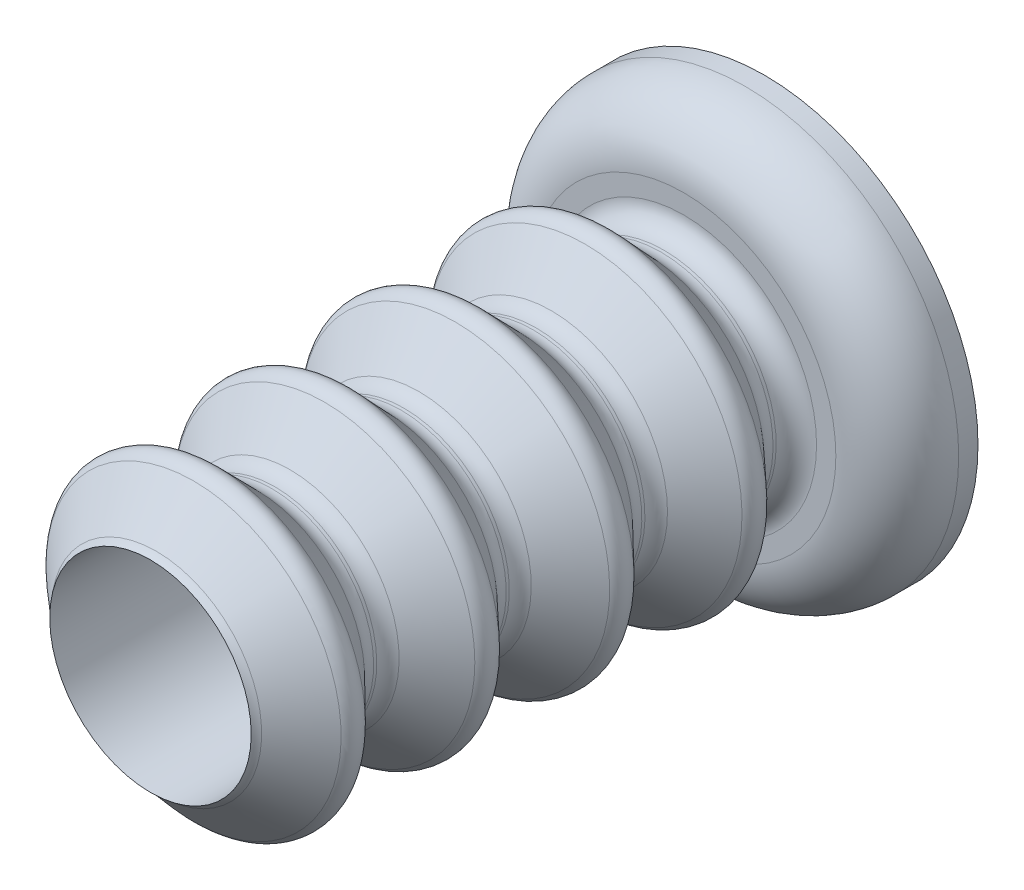
ISO-10303-21;
HEADER;
FILE_DESCRIPTION(('STEP AP214'),'2;1');
FILE_NAME('part.step','',(''),(''),'','','');
FILE_SCHEMA(('AUTOMOTIVE_DESIGN { 1 0 10303 214 1 1 1 1 }'));
ENDSEC;
DATA;
#1=APPLICATION_CONTEXT('core data for automotive mechanical design processes');
#2=APPLICATION_PROTOCOL_DEFINITION('international standard','automotive_design',2000,#1);
#3=PRODUCT_CONTEXT('',#1,'mechanical');
#4=PRODUCT('Part','Part','',(#3));
#5=PRODUCT_RELATED_PRODUCT_CATEGORY('part','',(#4));
#6=PRODUCT_DEFINITION_FORMATION('','',#4);
#7=PRODUCT_DEFINITION_CONTEXT('part definition',#1,'design');
#8=PRODUCT_DEFINITION('design','',#6,#7);
#9=PRODUCT_DEFINITION_SHAPE('','',#8);
#10=(LENGTH_UNIT() NAMED_UNIT(*) SI_UNIT(.MILLI.,.METRE.));
#11=(NAMED_UNIT(*) PLANE_ANGLE_UNIT() SI_UNIT($,.RADIAN.));
#12=(NAMED_UNIT(*) SI_UNIT($,.STERADIAN.) SOLID_ANGLE_UNIT());
#13=UNCERTAINTY_MEASURE_WITH_UNIT(LENGTH_MEASURE(1.E-05),#10,'distance_accuracy_value','');
#14=(GEOMETRIC_REPRESENTATION_CONTEXT(3) GLOBAL_UNCERTAINTY_ASSIGNED_CONTEXT((#13)) GLOBAL_UNIT_ASSIGNED_CONTEXT((#10,
#11,#12)) REPRESENTATION_CONTEXT('',''));
#15=CARTESIAN_POINT('',(0.,0.,0.));
#16=DIRECTION('',(0.,0.,1.));
#17=DIRECTION('',(1.,0.,0.));
#18=AXIS2_PLACEMENT_3D('',#15,#16,#17);
#19=CARTESIAN_POINT('',(0.,0.,139.849490611376));
#20=DIRECTION('',(0.,0.,1.));
#21=DIRECTION('',(0.,-1.,0.));
#22=AXIS2_PLACEMENT_3D('',#19,#20,#21);
#23=PLANE('',#22);
#24=CARTESIAN_POINT('',(0.,0.,139.849490611376));
#25=DIRECTION('',(0.,0.,-1.));
#26=DIRECTION('',(0.,1.,0.));
#27=AXIS2_PLACEMENT_3D('',#24,#25,#26);
#28=CIRCLE('',#27,12.5);
#29=CARTESIAN_POINT('',(0.,12.5,139.849490611376));
#30=VERTEX_POINT('',#29);
#31=EDGE_CURVE('E10',#30,#30,#28,.T.);
#32=ORIENTED_EDGE('',*,*,#31,.F.);
#33=EDGE_LOOP('',(#32));
#34=FACE_BOUND('',#33,.T.);
#35=CARTESIAN_POINT('',(0.,0.,139.849490611376));
#36=DIRECTION('',(0.,0.,-1.));
#37=DIRECTION('',(0.,1.,0.));
#38=AXIS2_PLACEMENT_3D('',#35,#36,#37);
#39=CIRCLE('',#38,26.4870024987545);
#40=CARTESIAN_POINT('',(0.,26.4870024987545,139.849490611376));
#41=VERTEX_POINT('',#40);
#42=EDGE_CURVE('E127',#41,#41,#39,.T.);
#43=ORIENTED_EDGE('',*,*,#42,.T.);
#44=EDGE_LOOP('',(#43));
#45=FACE_BOUND('',#44,.T.);
#46=ADVANCED_FACE('F32',(#34,#45),#23,.F.);
#47=CARTESIAN_POINT('',(0.,0.,139.849490611376));
#48=DIRECTION('',(0.,0.,-1.));
#49=DIRECTION('',(0.,1.,0.));
#50=AXIS2_PLACEMENT_3D('',#47,#48,#49);
#51=CYLINDRICAL_SURFACE('',#50,26.4870024987545);
#52=CARTESIAN_POINT('',(0.,0.,142.246357019799));
#53=DIRECTION('',(0.,0.,-1.));
#54=DIRECTION('',(0.,1.,0.));
#55=AXIS2_PLACEMENT_3D('',#52,#53,#54);
#56=CIRCLE('',#55,26.4870024987545);
#57=CARTESIAN_POINT('',(0.,26.4870024987545,142.246357019799));
#58=VERTEX_POINT('',#57);
#59=EDGE_CURVE('E124',#58,#58,#56,.T.);
#60=ORIENTED_EDGE('',*,*,#59,.T.);
#61=EDGE_LOOP('',(#60));
#62=FACE_BOUND('',#61,.T.);
#63=ORIENTED_EDGE('',*,*,#42,.F.);
#64=EDGE_LOOP('',(#63));
#65=FACE_BOUND('',#64,.T.);
#66=ADVANCED_FACE('F132',(#62,#65),#51,.T.);
#67=CARTESIAN_POINT('',(0.,0.,142.246357019799));
#68=DIRECTION('',(0.,0.,-1.));
#69=DIRECTION('',(0.,1.,0.));
#70=AXIS2_PLACEMENT_3D('',#67,#68,#69);
#71=TOROIDAL_SURFACE('',#70,18.8670024987545,7.61999999999999);
#72=CARTESIAN_POINT('',(0.,0.,149.866357019799));
#73=DIRECTION('',(0.,0.,-1.));
#74=DIRECTION('',(0.,1.,0.));
#75=AXIS2_PLACEMENT_3D('',#72,#73,#74);
#76=CIRCLE('',#75,18.8670024987544);
#77=CARTESIAN_POINT('',(0.,18.8670024987544,149.866357019799));
#78=VERTEX_POINT('',#77);
#79=EDGE_CURVE('E121',#78,#78,#76,.T.);
#80=ORIENTED_EDGE('',*,*,#79,.T.);
#81=EDGE_LOOP('',(#80));
#82=FACE_BOUND('',#81,.T.);
#83=ORIENTED_EDGE('',*,*,#59,.F.);
#84=EDGE_LOOP('',(#83));
#85=FACE_BOUND('',#84,.T.);
#86=ADVANCED_FACE('F134',(#82,#85),#71,.T.);
#87=CARTESIAN_POINT('',(0.,0.,149.866357019799));
#88=DIRECTION('',(0.,0.,1.));
#89=DIRECTION('',(0.,-1.,0.));
#90=AXIS2_PLACEMENT_3D('',#87,#88,#89);
#91=PLANE('',#90);
#92=CARTESIAN_POINT('',(0.,0.,149.866357019799));
#93=DIRECTION('',(0.,0.,-1.));
#94=DIRECTION('',(0.,1.,0.));
#95=AXIS2_PLACEMENT_3D('',#92,#93,#94);
#96=CIRCLE('',#95,16.4732935887358);
#97=CARTESIAN_POINT('',(0.,16.4732935887358,149.866357019799));
#98=VERTEX_POINT('',#97);
#99=EDGE_CURVE('E118',#98,#98,#96,.T.);
#100=ORIENTED_EDGE('',*,*,#99,.T.);
#101=EDGE_LOOP('',(#100));
#102=FACE_BOUND('',#101,.T.);
#103=ORIENTED_EDGE('',*,*,#79,.F.);
#104=EDGE_LOOP('',(#103));
#105=FACE_BOUND('',#104,.T.);
#106=ADVANCED_FACE('F141',(#102,#105),#91,.T.);
#107=CARTESIAN_POINT('',(0.,0.,152.406357019799));
#108=DIRECTION('',(0.,0.,-1.));
#109=DIRECTION('',(0.,1.,0.));
#110=AXIS2_PLACEMENT_3D('',#107,#108,#109);
#111=TOROIDAL_SURFACE('',#110,16.4732935887358,2.54);
#112=CARTESIAN_POINT('',(0.,0.,152.338774984528));
#113=DIRECTION('',(0.,0.,-1.));
#114=DIRECTION('',(0.,1.,0.));
#115=AXIS2_PLACEMENT_3D('',#112,#113,#114);
#116=CIRCLE('',#115,13.9341928289177);
#117=CARTESIAN_POINT('',(0.,13.9341928289177,152.338774984528));
#118=VERTEX_POINT('',#117);
#119=EDGE_CURVE('E115',#118,#118,#116,.T.);
#120=ORIENTED_EDGE('',*,*,#119,.T.);
#121=EDGE_LOOP('',(#120));
#122=FACE_BOUND('',#121,.T.);
#123=ORIENTED_EDGE('',*,*,#99,.F.);
#124=EDGE_LOOP('',(#123));
#125=FACE_BOUND('',#124,.T.);
#126=ADVANCED_FACE('F149',(#122,#125),#111,.F.);
#127=CARTESIAN_POINT('',(0.,0.,152.338774984528));
#128=DIRECTION('',(0.,0.,-1.));
#129=DIRECTION('',(0.,1.,0.));
#130=AXIS2_PLACEMENT_3D('',#127,#128,#129);
#131=CONICAL_SURFACE('',#130,13.9341928289177,0.0266102408628679);
#132=CARTESIAN_POINT('',(0.,0.,152.716566295555));
#133=DIRECTION('',(0.,0.,-1.));
#134=DIRECTION('',(0.,1.,0.));
#135=AXIS2_PLACEMENT_3D('',#132,#133,#134);
#136=CIRCLE('',#135,13.9241373375757);
#137=CARTESIAN_POINT('',(0.,13.9241373375757,152.716566295555));
#138=VERTEX_POINT('',#137);
#139=EDGE_CURVE('E112',#138,#138,#136,.T.);
#140=ORIENTED_EDGE('',*,*,#139,.T.);
#141=EDGE_LOOP('',(#140));
#142=FACE_BOUND('',#141,.T.);
#143=ORIENTED_EDGE('',*,*,#119,.F.);
#144=EDGE_LOOP('',(#143));
#145=FACE_BOUND('',#144,.T.);
#146=ADVANCED_FACE('F153',(#142,#145),#131,.T.);
#147=CARTESIAN_POINT('',(0.,0.,152.784148330825));
#148=DIRECTION('',(0.,0.,-1.));
#149=DIRECTION('',(0.,1.,0.));
#150=AXIS2_PLACEMENT_3D('',#147,#148,#149);
#151=TOROIDAL_SURFACE('',#150,16.4632380973938,2.54);
#152=ORIENTED_EDGE('',*,*,#139,.F.);
#153=EDGE_LOOP('',(#152));
#154=FACE_BOUND('',#153,.T.);
#155=CARTESIAN_POINT('',(0.,0.,154.646241621569));
#156=DIRECTION('',(0.,0.,-1.));
#157=DIRECTION('',(0.,1.,0.));
#158=AXIS2_PLACEMENT_3D('',#155,#156,#157);
#159=CIRCLE('',#158,14.7357518958376);
#160=CARTESIAN_POINT('',(0.,14.7357518958376,154.646241621569));
#161=VERTEX_POINT('',#160);
#162=EDGE_CURVE('E109',#161,#161,#159,.T.);
#163=ORIENTED_EDGE('',*,*,#162,.T.);
#164=EDGE_LOOP('',(#163));
#165=FACE_BOUND('',#164,.T.);
#166=ADVANCED_FACE('F157',(#154,#165),#151,.F.);
#167=CARTESIAN_POINT('',(0.,0.,154.646241621569));
#168=DIRECTION('',(0.,0.,1.));
#169=DIRECTION('',(0.,-1.,0.));
#170=AXIS2_PLACEMENT_3D('',#167,#168,#169);
#171=CONICAL_SURFACE('',#170,14.7357518958376,0.822880004262752);
#172=CARTESIAN_POINT('',(0.,0.,159.110721108636));
#173=DIRECTION('',(0.,0.,-1.));
#174=DIRECTION('',(0.,1.,0.));
#175=AXIS2_PLACEMENT_3D('',#172,#173,#174);
#176=CIRCLE('',#175,19.5481071505664);
#177=CARTESIAN_POINT('',(0.,19.5481071505664,159.110721108636));
#178=VERTEX_POINT('',#177);
#179=EDGE_CURVE('E106',#178,#178,#176,.T.);
#180=ORIENTED_EDGE('',*,*,#179,.T.);
#181=EDGE_LOOP('',(#180));
#182=FACE_BOUND('',#181,.T.);
#183=ORIENTED_EDGE('',*,*,#162,.F.);
#184=EDGE_LOOP('',(#183));
#185=FACE_BOUND('',#184,.T.);
#186=ADVANCED_FACE('F161',(#182,#185),#171,.T.);
#187=CARTESIAN_POINT('',(0.,0.,160.576936298198));
#188=DIRECTION('',(0.,0.,-1.));
#189=DIRECTION('',(0.,1.,0.));
#190=AXIS2_PLACEMENT_3D('',#187,#188,#189);
#191=TOROIDAL_SURFACE('',#190,18.1878817950102,1.99999999999999);
#192=CARTESIAN_POINT('',(0.,0.,162.113433188959));
#193=DIRECTION('',(0.,0.,-1.));
#194=DIRECTION('',(0.,1.,0.));
#195=AXIS2_PLACEMENT_3D('',#192,#193,#194);
#196=CIRCLE('',#195,19.4681853936467);
#197=CARTESIAN_POINT('',(0.,19.4681853936467,162.113433188959));
#198=VERTEX_POINT('',#197);
#199=EDGE_CURVE('E103',#198,#198,#196,.T.);
#200=ORIENTED_EDGE('',*,*,#199,.T.);
#201=EDGE_LOOP('',(#200));
#202=FACE_BOUND('',#201,.T.);
#203=ORIENTED_EDGE('',*,*,#179,.F.);
#204=EDGE_LOOP('',(#203));
#205=FACE_BOUND('',#204,.T.);
#206=ADVANCED_FACE('F165',(#202,#205),#191,.T.);
#207=CARTESIAN_POINT('',(0.,0.,162.113433188959));
#208=DIRECTION('',(0.,0.,-1.));
#209=DIRECTION('',(0.,1.,0.));
#210=AXIS2_PLACEMENT_3D('',#207,#208,#209);
#211=CONICAL_SURFACE('',#210,19.4681853936467,0.876100485988482);
#212=CARTESIAN_POINT('',(0.,0.,166.315596551069));
#213=DIRECTION('',(0.,0.,-1.));
#214=DIRECTION('',(0.,1.,0.));
#215=AXIS2_PLACEMENT_3D('',#212,#213,#214);
#216=CIRCLE('',#215,14.4251542350778);
#217=CARTESIAN_POINT('',(0.,14.4251542350778,166.315596551069));
#218=VERTEX_POINT('',#217);
#219=EDGE_CURVE('E100',#218,#218,#216,.T.);
#220=ORIENTED_EDGE('',*,*,#219,.T.);
#221=EDGE_LOOP('',(#220));
#222=FACE_BOUND('',#221,.T.);
#223=ORIENTED_EDGE('',*,*,#199,.F.);
#224=EDGE_LOOP('',(#223));
#225=FACE_BOUND('',#224,.T.);
#226=ADVANCED_FACE('F169',(#222,#225),#211,.T.);
#227=CARTESIAN_POINT('',(0.,0.,168.266947602335));
#228=DIRECTION('',(0.,0.,-1.));
#229=DIRECTION('',(0.,1.,0.));
#230=AXIS2_PLACEMENT_3D('',#227,#228,#229);
#231=TOROIDAL_SURFACE('',#230,16.0511398053462,2.54000000000003);
#232=CARTESIAN_POINT('',(0.,0.,168.199365567065));
#233=DIRECTION('',(0.,0.,-1.));
#234=DIRECTION('',(0.,1.,0.));
#235=AXIS2_PLACEMENT_3D('',#232,#233,#234);
#236=CIRCLE('',#235,13.5120390455281);
#237=CARTESIAN_POINT('',(0.,13.5120390455281,168.199365567065));
#238=VERTEX_POINT('',#237);
#239=EDGE_CURVE('E97',#238,#238,#236,.T.);
#240=ORIENTED_EDGE('',*,*,#239,.T.);
#241=EDGE_LOOP('',(#240));
#242=FACE_BOUND('',#241,.T.);
#243=ORIENTED_EDGE('',*,*,#219,.F.);
#244=EDGE_LOOP('',(#243));
#245=FACE_BOUND('',#244,.T.);
#246=ADVANCED_FACE('F173',(#242,#245),#231,.F.);
#247=CARTESIAN_POINT('',(0.,0.,168.199365567065));
#248=DIRECTION('',(0.,0.,-1.));
#249=DIRECTION('',(0.,1.,0.));
#250=AXIS2_PLACEMENT_3D('',#247,#248,#249);
#251=CONICAL_SURFACE('',#250,13.5120390455281,0.026610240862866);
#252=CARTESIAN_POINT('',(0.,0.,168.577156878092));
#253=DIRECTION('',(0.,0.,-1.));
#254=DIRECTION('',(0.,1.,0.));
#255=AXIS2_PLACEMENT_3D('',#252,#253,#254);
#256=CIRCLE('',#255,13.5019835541861);
#257=CARTESIAN_POINT('',(0.,13.5019835541861,168.577156878092));
#258=VERTEX_POINT('',#257);
#259=EDGE_CURVE('E94',#258,#258,#256,.T.);
#260=ORIENTED_EDGE('',*,*,#259,.T.);
#261=EDGE_LOOP('',(#260));
#262=FACE_BOUND('',#261,.T.);
#263=ORIENTED_EDGE('',*,*,#239,.F.);
#264=EDGE_LOOP('',(#263));
#265=FACE_BOUND('',#264,.T.);
#266=ADVANCED_FACE('F177',(#262,#265),#251,.T.);
#267=CARTESIAN_POINT('',(0.,0.,168.644738913362));
#268=DIRECTION('',(0.,0.,-1.));
#269=DIRECTION('',(0.,1.,0.));
#270=AXIS2_PLACEMENT_3D('',#267,#268,#269);
#271=TOROIDAL_SURFACE('',#270,16.0410843140042,2.54000000000004);
#272=ORIENTED_EDGE('',*,*,#259,.F.);
#273=EDGE_LOOP('',(#272));
#274=FACE_BOUND('',#273,.T.);
#275=CARTESIAN_POINT('',(0.,0.,170.468521369014));
#276=DIRECTION('',(0.,0.,-1.));
#277=DIRECTION('',(0.,1.,0.));
#278=AXIS2_PLACEMENT_3D('',#275,#276,#277);
#279=CIRCLE('',#278,14.2731992627478);
#280=CARTESIAN_POINT('',(0.,14.2731992627478,170.468521369014));
#281=VERTEX_POINT('',#280);
#282=EDGE_CURVE('E91',#281,#281,#279,.T.);
#283=ORIENTED_EDGE('',*,*,#282,.T.);
#284=EDGE_LOOP('',(#283));
#285=FACE_BOUND('',#284,.T.);
#286=ADVANCED_FACE('F181',(#274,#285),#271,.F.);
#287=CARTESIAN_POINT('',(0.,0.,170.468521369014));
#288=DIRECTION('',(0.,0.,1.));
#289=DIRECTION('',(0.,-1.,0.));
#290=AXIS2_PLACEMENT_3D('',#287,#288,#289);
#291=CONICAL_SURFACE('',#290,14.2731992627478,0.800959985861467);
#292=CARTESIAN_POINT('',(0.,0.,175.267267946345));
#293=DIRECTION('',(0.,0.,-1.));
#294=DIRECTION('',(0.,1.,0.));
#295=AXIS2_PLACEMENT_3D('',#292,#293,#294);
#296=CIRCLE('',#295,19.2236737354163);
#297=CARTESIAN_POINT('',(0.,19.2236737354163,175.267267946345));
#298=VERTEX_POINT('',#297);
#299=EDGE_CURVE('E88',#298,#298,#296,.T.);
#300=ORIENTED_EDGE('',*,*,#299,.T.);
#301=EDGE_LOOP('',(#300));
#302=FACE_BOUND('',#301,.T.);
#303=ORIENTED_EDGE('',*,*,#282,.F.);
#304=EDGE_LOOP('',(#303));
#305=FACE_BOUND('',#304,.T.);
#306=ADVANCED_FACE('F185',(#302,#305),#291,.T.);
#307=CARTESIAN_POINT('',(0.,0.,176.703317124024));
#308=DIRECTION('',(0.,0.,-1.));
#309=DIRECTION('',(0.,1.,0.));
#310=AXIS2_PLACEMENT_3D('',#307,#308,#309);
#311=TOROIDAL_SURFACE('',#310,17.8316382619862,2.00000000000002);
#312=CARTESIAN_POINT('',(0.,0.,178.211382864941));
#313=DIRECTION('',(0.,0.,-1.));
#314=DIRECTION('',(0.,1.,0.));
#315=AXIS2_PLACEMENT_3D('',#312,#313,#314);
#316=CIRCLE('',#315,19.1453116312342);
#317=CARTESIAN_POINT('',(0.,19.1453116312342,178.211382864941));
#318=VERTEX_POINT('',#317);
#319=EDGE_CURVE('E85',#318,#318,#316,.T.);
#320=ORIENTED_EDGE('',*,*,#319,.T.);
#321=EDGE_LOOP('',(#320));
#322=FACE_BOUND('',#321,.T.);
#323=ORIENTED_EDGE('',*,*,#299,.F.);
#324=EDGE_LOOP('',(#323));
#325=FACE_BOUND('',#324,.T.);
#326=ADVANCED_FACE('F189',(#322,#325),#311,.T.);
#327=CARTESIAN_POINT('',(0.,0.,178.211382864941));
#328=DIRECTION('',(0.,0.,-1.));
#329=DIRECTION('',(0.,1.,0.));
#330=AXIS2_PLACEMENT_3D('',#327,#328,#329);
#331=CONICAL_SURFACE('',#330,19.1453116312342,0.854180467587189);
#332=CARTESIAN_POINT('',(0.,0.,182.739992734973));
#333=DIRECTION('',(0.,0.,-1.));
#334=DIRECTION('',(0.,1.,0.));
#335=AXIS2_PLACEMENT_3D('',#332,#333,#334);
#336=CIRCLE('',#335,13.9465753556532);
#337=CARTESIAN_POINT('',(0.,13.9465753556532,182.739992734973));
#338=VERTEX_POINT('',#337);
#339=EDGE_CURVE('E82',#338,#338,#336,.T.);
#340=ORIENTED_EDGE('',*,*,#339,.T.);
#341=EDGE_LOOP('',(#340));
#342=FACE_BOUND('',#341,.T.);
#343=ORIENTED_EDGE('',*,*,#319,.F.);
#344=EDGE_LOOP('',(#343));
#345=FACE_BOUND('',#344,.T.);
#346=ADVANCED_FACE('F193',(#342,#345),#331,.T.);
#347=CARTESIAN_POINT('',(0.,0.,184.655236225938));
#348=DIRECTION('',(0.,0.,-1.));
#349=DIRECTION('',(0.,1.,0.));
#350=AXIS2_PLACEMENT_3D('',#347,#348,#349);
#351=TOROIDAL_SURFACE('',#350,15.6149405345981,2.53999999999989);
#352=CARTESIAN_POINT('',(0.,0.,184.587654190667));
#353=DIRECTION('',(0.,0.,-1.));
#354=DIRECTION('',(0.,1.,0.));
#355=AXIS2_PLACEMENT_3D('',#352,#353,#354);
#356=CIRCLE('',#355,13.0758397747801);
#357=CARTESIAN_POINT('',(0.,13.0758397747801,184.587654190667));
#358=VERTEX_POINT('',#357);
#359=EDGE_CURVE('E79',#358,#358,#356,.T.);
#360=ORIENTED_EDGE('',*,*,#359,.T.);
#361=EDGE_LOOP('',(#360));
#362=FACE_BOUND('',#361,.T.);
#363=ORIENTED_EDGE('',*,*,#339,.F.);
#364=EDGE_LOOP('',(#363));
#365=FACE_BOUND('',#364,.T.);
#366=ADVANCED_FACE('F197',(#362,#365),#351,.F.);
#367=CARTESIAN_POINT('',(0.,0.,184.587654190667));
#368=DIRECTION('',(0.,0.,-1.));
#369=DIRECTION('',(0.,1.,0.));
#370=AXIS2_PLACEMENT_3D('',#367,#368,#369);
#371=CONICAL_SURFACE('',#370,13.0758397747801,0.0266102408628654);
#372=CARTESIAN_POINT('',(0.,0.,184.965445501694));
#373=DIRECTION('',(0.,0.,-1.));
#374=DIRECTION('',(0.,1.,0.));
#375=AXIS2_PLACEMENT_3D('',#372,#373,#374);
#376=CIRCLE('',#375,13.0657842834381);
#377=CARTESIAN_POINT('',(0.,13.0657842834381,184.965445501694));
#378=VERTEX_POINT('',#377);
#379=EDGE_CURVE('E76',#378,#378,#376,.T.);
#380=ORIENTED_EDGE('',*,*,#379,.T.);
#381=EDGE_LOOP('',(#380));
#382=FACE_BOUND('',#381,.T.);
#383=ORIENTED_EDGE('',*,*,#359,.F.);
#384=EDGE_LOOP('',(#383));
#385=FACE_BOUND('',#384,.T.);
#386=ADVANCED_FACE('F201',(#382,#385),#371,.T.);
#387=CARTESIAN_POINT('',(0.,0.,185.033027536965));
#388=DIRECTION('',(0.,0.,-1.));
#389=DIRECTION('',(0.,1.,0.));
#390=AXIS2_PLACEMENT_3D('',#387,#388,#389);
#391=TOROIDAL_SURFACE('',#390,15.6048850432562,2.54000000000004);
#392=ORIENTED_EDGE('',*,*,#379,.F.);
#393=EDGE_LOOP('',(#392));
#394=FACE_BOUND('',#393,.T.);
#395=CARTESIAN_POINT('',(0.,0.,186.883125030149));
#396=DIRECTION('',(0.,0.,-1.));
#397=DIRECTION('',(0.,1.,0.));
#398=AXIS2_PLACEMENT_3D('',#395,#396,#397);
#399=CIRCLE('',#398,13.8645576988426);
#400=CARTESIAN_POINT('',(0.,13.8645576988426,186.883125030149));
#401=VERTEX_POINT('',#400);
#402=EDGE_CURVE('E73',#401,#401,#399,.T.);
#403=ORIENTED_EDGE('',*,*,#402,.T.);
#404=EDGE_LOOP('',(#403));
#405=FACE_BOUND('',#404,.T.);
#406=ADVANCED_FACE('F205',(#394,#405),#391,.F.);
#407=CARTESIAN_POINT('',(0.,0.,186.883125030149));
#408=DIRECTION('',(0.,0.,1.));
#409=DIRECTION('',(0.,-1.,0.));
#410=AXIS2_PLACEMENT_3D('',#407,#408,#409);
#411=CONICAL_SURFACE('',#410,13.8645576988426,0.815961668225431);
#412=CARTESIAN_POINT('',(0.,0.,191.451654284835));
#413=DIRECTION('',(0.,0.,-1.));
#414=DIRECTION('',(0.,1.,0.));
#415=AXIS2_PLACEMENT_3D('',#412,#413,#414);
#416=CIRCLE('',#415,18.7212443151655);
#417=CARTESIAN_POINT('',(0.,18.7212443151655,191.451654284835));
#418=VERTEX_POINT('',#417);
#419=EDGE_CURVE('E70',#418,#418,#416,.T.);
#420=ORIENTED_EDGE('',*,*,#419,.T.);
#421=EDGE_LOOP('',(#420));
#422=FACE_BOUND('',#421,.T.);
#423=ORIENTED_EDGE('',*,*,#402,.F.);
#424=EDGE_LOOP('',(#423));
#425=FACE_BOUND('',#424,.T.);
#426=ADVANCED_FACE('F209',(#422,#425),#411,.T.);
#427=CARTESIAN_POINT('',(0.,0.,192.908423964508));
#428=DIRECTION('',(0.,0.,-1.));
#429=DIRECTION('',(0.,1.,0.));
#430=AXIS2_PLACEMENT_3D('',#427,#428,#429);
#431=TOROIDAL_SURFACE('',#430,17.3509078235013,1.99999999999998);
#432=CARTESIAN_POINT('',(0.,0.,194.436026584587));
#433=DIRECTION('',(0.,0.,-1.));
#434=DIRECTION('',(0.,1.,0.));
#435=AXIS2_PLACEMENT_3D('',#432,#433,#434);
#436=CIRCLE('',#435,18.6418106994482);
#437=CARTESIAN_POINT('',(0.,18.6418106994481,194.436026584587));
#438=VERTEX_POINT('',#437);
#439=EDGE_CURVE('E67',#438,#438,#436,.T.);
#440=ORIENTED_EDGE('',*,*,#439,.T.);
#441=EDGE_LOOP('',(#440));
#442=FACE_BOUND('',#441,.T.);
#443=ORIENTED_EDGE('',*,*,#419,.F.);
#444=EDGE_LOOP('',(#443));
#445=FACE_BOUND('',#444,.T.);
#446=ADVANCED_FACE('F213',(#442,#445),#431,.T.);
#447=CARTESIAN_POINT('',(0.,0.,194.436026584587));
#448=DIRECTION('',(0.,0.,-1.));
#449=DIRECTION('',(0.,1.,0.));
#450=AXIS2_PLACEMENT_3D('',#447,#448,#449);
#451=CONICAL_SURFACE('',#450,18.6418106994482,0.869182149951164);
#452=CARTESIAN_POINT('',(0.,0.,198.739734169984));
#453=DIRECTION('',(0.,0.,-1.));
#454=DIRECTION('',(0.,1.,0.));
#455=AXIS2_PLACEMENT_3D('',#452,#453,#454);
#456=CIRCLE('',#455,13.5489759819761);
#457=CARTESIAN_POINT('',(0.,13.5489759819761,198.739734169984));
#458=VERTEX_POINT('',#457);
#459=EDGE_CURVE('E64',#458,#458,#456,.T.);
#460=ORIENTED_EDGE('',*,*,#459,.T.);
#461=EDGE_LOOP('',(#460));
#462=FACE_BOUND('',#461,.T.);
#463=ORIENTED_EDGE('',*,*,#439,.F.);
#464=EDGE_LOOP('',(#463));
#465=FACE_BOUND('',#464,.T.);
#466=ADVANCED_FACE('F217',(#462,#465),#451,.T.);
#467=CARTESIAN_POINT('',(0.,0.,200.679789497484));
#468=DIRECTION('',(0.,0.,-1.));
#469=DIRECTION('',(0.,1.,0.));
#470=AXIS2_PLACEMENT_3D('',#467,#468,#469);
#471=TOROIDAL_SURFACE('',#470,15.1884226344286,2.53999999999997);
#472=CARTESIAN_POINT('',(0.,0.,200.612207462213));
#473=DIRECTION('',(0.,0.,-1.));
#474=DIRECTION('',(0.,1.,0.));
#475=AXIS2_PLACEMENT_3D('',#472,#473,#474);
#476=CIRCLE('',#475,12.6493218746106);
#477=CARTESIAN_POINT('',(0.,12.6493218746106,200.612207462213));
#478=VERTEX_POINT('',#477);
#479=EDGE_CURVE('E61',#478,#478,#476,.T.);
#480=ORIENTED_EDGE('',*,*,#479,.T.);
#481=EDGE_LOOP('',(#480));
#482=FACE_BOUND('',#481,.T.);
#483=ORIENTED_EDGE('',*,*,#459,.F.);
#484=EDGE_LOOP('',(#483));
#485=FACE_BOUND('',#484,.T.);
#486=ADVANCED_FACE('F221',(#482,#485),#471,.F.);
#487=CARTESIAN_POINT('',(0.,0.,200.612207462213));
#488=DIRECTION('',(0.,0.,-1.));
#489=DIRECTION('',(0.,1.,0.));
#490=AXIS2_PLACEMENT_3D('',#487,#488,#489);
#491=CONICAL_SURFACE('',#490,12.6493218746106,0.026610240862866);
#492=CARTESIAN_POINT('',(0.,0.,200.98999877324));
#493=DIRECTION('',(0.,0.,-1.));
#494=DIRECTION('',(0.,1.,0.));
#495=AXIS2_PLACEMENT_3D('',#492,#493,#494);
#496=CIRCLE('',#495,12.6392663832686);
#497=CARTESIAN_POINT('',(0.,12.6392663832686,200.98999877324));
#498=VERTEX_POINT('',#497);
#499=EDGE_CURVE('E58',#498,#498,#496,.T.);
#500=ORIENTED_EDGE('',*,*,#499,.T.);
#501=EDGE_LOOP('',(#500));
#502=FACE_BOUND('',#501,.T.);
#503=ORIENTED_EDGE('',*,*,#479,.F.);
#504=EDGE_LOOP('',(#503));
#505=FACE_BOUND('',#504,.T.);
#506=ADVANCED_FACE('F225',(#502,#505),#491,.T.);
#507=CARTESIAN_POINT('',(0.,0.,201.057580808511));
#508=DIRECTION('',(0.,0.,-1.));
#509=DIRECTION('',(0.,1.,0.));
#510=AXIS2_PLACEMENT_3D('',#507,#508,#509);
#511=TOROIDAL_SURFACE('',#510,15.1783671430867,2.54000000000006);
#512=ORIENTED_EDGE('',*,*,#499,.F.);
#513=EDGE_LOOP('',(#512));
#514=FACE_BOUND('',#513,.T.);
#515=CARTESIAN_POINT('',(0.,0.,202.870414529049));
#516=DIRECTION('',(0.,0.,-1.));
#517=DIRECTION('',(0.,1.,0.));
#518=AXIS2_PLACEMENT_3D('',#515,#516,#517);
#519=CIRCLE('',#518,13.3992567188346);
#520=CARTESIAN_POINT('',(0.,13.3992567188345,202.870414529049));
#521=VERTEX_POINT('',#520);
#522=EDGE_CURVE('E55',#521,#521,#519,.T.);
#523=ORIENTED_EDGE('',*,*,#522,.T.);
#524=EDGE_LOOP('',(#523));
#525=FACE_BOUND('',#524,.T.);
#526=ADVANCED_FACE('F229',(#514,#525),#511,.F.);
#527=CARTESIAN_POINT('',(0.,0.,202.870414529049));
#528=DIRECTION('',(0.,0.,1.));
#529=DIRECTION('',(0.,-1.,0.));
#530=AXIS2_PLACEMENT_3D('',#527,#528,#529);
#531=CONICAL_SURFACE('',#530,13.3992567188346,0.794786479062887);
#532=CARTESIAN_POINT('',(0.,0.,207.765783323296));
#533=DIRECTION('',(0.,0.,-1.));
#534=DIRECTION('',(0.,1.,0.));
#535=AXIS2_PLACEMENT_3D('',#532,#533,#534);
#536=CIRCLE('',#535,18.3874179390181);
#537=CARTESIAN_POINT('',(0.,18.3874179390181,207.765783323296));
#538=VERTEX_POINT('',#537);
#539=EDGE_CURVE('E52',#538,#538,#536,.T.);
#540=ORIENTED_EDGE('',*,*,#539,.T.);
#541=EDGE_LOOP('',(#540));
#542=FACE_BOUND('',#541,.T.);
#543=ORIENTED_EDGE('',*,*,#522,.F.);
#544=EDGE_LOOP('',(#543));
#545=FACE_BOUND('',#544,.T.);
#546=ADVANCED_FACE('F233',(#542,#545),#531,.T.);
#547=CARTESIAN_POINT('',(0.,0.,209.193211449703));
#548=DIRECTION('',(0.,0.,-1.));
#549=DIRECTION('',(0.,1.,0.));
#550=AXIS2_PLACEMENT_3D('',#547,#548,#549);
#551=TOROIDAL_SURFACE('',#550,16.9865435892133,2.00000000000001);
#552=CARTESIAN_POINT('',(0.,0.,210.693138532909));
#553=DIRECTION('',(0.,0.,-1.));
#554=DIRECTION('',(0.,1.,0.));
#555=AXIS2_PLACEMENT_3D('',#552,#553,#554);
#556=CIRCLE('',#555,18.3095019200254);
#557=CARTESIAN_POINT('',(0.,18.3095019200254,210.693138532909));
#558=VERTEX_POINT('',#557);
#559=EDGE_CURVE('E47',#558,#558,#556,.T.);
#560=ORIENTED_EDGE('',*,*,#559,.T.);
#561=EDGE_LOOP('',(#560));
#562=FACE_BOUND('',#561,.T.);
#563=ORIENTED_EDGE('',*,*,#539,.F.);
#564=EDGE_LOOP('',(#563));
#565=FACE_BOUND('',#564,.T.);
#566=ADVANCED_FACE('F237',(#562,#565),#551,.T.);
#567=CARTESIAN_POINT('',(0.,0.,210.693138532909));
#568=DIRECTION('',(0.,0.,-1.));
#569=DIRECTION('',(0.,1.,0.));
#570=AXIS2_PLACEMENT_3D('',#567,#568,#569);
#571=CONICAL_SURFACE('',#570,18.3095019200254,0.848006960788617);
#572=CARTESIAN_POINT('',(0.,0.,215.316229054661));
#573=DIRECTION('',(0.,0.,-1.));
#574=DIRECTION('',(0.,1.,0.));
#575=AXIS2_PLACEMENT_3D('',#572,#573,#574);
#576=CIRCLE('',#575,13.0679924029183);
#577=CARTESIAN_POINT('',(0.,13.0679924029183,215.316229054661));
#578=VERTEX_POINT('',#577);
#579=EDGE_CURVE('E43',#578,#578,#576,.T.);
#580=ORIENTED_EDGE('',*,*,#579,.T.);
#581=EDGE_LOOP('',(#580));
#582=FACE_BOUND('',#581,.T.);
#583=ORIENTED_EDGE('',*,*,#559,.F.);
#584=EDGE_LOOP('',(#583));
#585=FACE_BOUND('',#584,.T.);
#586=ADVANCED_FACE('F241',(#582,#585),#571,.T.);
#587=CARTESIAN_POINT('',(0.,0.,217.221136450332));
#588=DIRECTION('',(0.,0.,-1.));
#589=DIRECTION('',(0.,1.,0.));
#590=AXIS2_PLACEMENT_3D('',#587,#588,#589);
#591=TOROIDAL_SURFACE('',#590,14.7481494830497,2.54000000000005);
#592=CARTESIAN_POINT('',(0.,0.,216.039009595099));
#593=DIRECTION('',(0.,0.,1.));
#594=DIRECTION('',(0.,-1.,0.));
#595=AXIS2_PLACEMENT_3D('',#592,#593,#594);
#596=CIRCLE('',#595,12.5);
#597=CARTESIAN_POINT('',(0.,-12.5,216.039009595099));
#598=VERTEX_POINT('',#597);
#599=EDGE_CURVE('E39',#598,#598,#596,.T.);
#600=ORIENTED_EDGE('',*,*,#599,.F.);
#601=EDGE_LOOP('',(#600));
#602=FACE_BOUND('',#601,.T.);
#603=ORIENTED_EDGE('',*,*,#579,.F.);
#604=EDGE_LOOP('',(#603));
#605=FACE_BOUND('',#604,.T.);
#606=ADVANCED_FACE('F244',(#602,#605),#591,.F.);
#607=CARTESIAN_POINT('',(0.,0.,238.665623674043));
#608=DIRECTION('',(0.,0.,-1.));
#609=DIRECTION('',(0.,1.,0.));
#610=AXIS2_PLACEMENT_3D('',#607,#608,#609);
#611=CYLINDRICAL_SURFACE('',#610,12.5);
#612=ORIENTED_EDGE('',*,*,#599,.T.);
#613=EDGE_LOOP('',(#612));
#614=FACE_BOUND('',#613,.T.);
#615=ORIENTED_EDGE('',*,*,#31,.T.);
#616=EDGE_LOOP('',(#615));
#617=FACE_BOUND('',#616,.T.);
#618=ADVANCED_FACE('F34',(#614,#617),#611,.F.);
#619=CLOSED_SHELL('',(#46,#66,#86,#106,#126,#146,#166,#186,#206,#226,#246,#266,#286,#306,#326,
#346,#366,#386,#406,#426,#446,#466,#486,#506,#526,#546,#566,#586,#606,#618));
#620=MANIFOLD_SOLID_BREP('B2',#619);
#621=ADVANCED_BREP_SHAPE_REPRESENTATION('',(#18,#620),#14);
#622=SHAPE_DEFINITION_REPRESENTATION(#9,#621);
ENDSEC;
END-ISO-10303-21;
